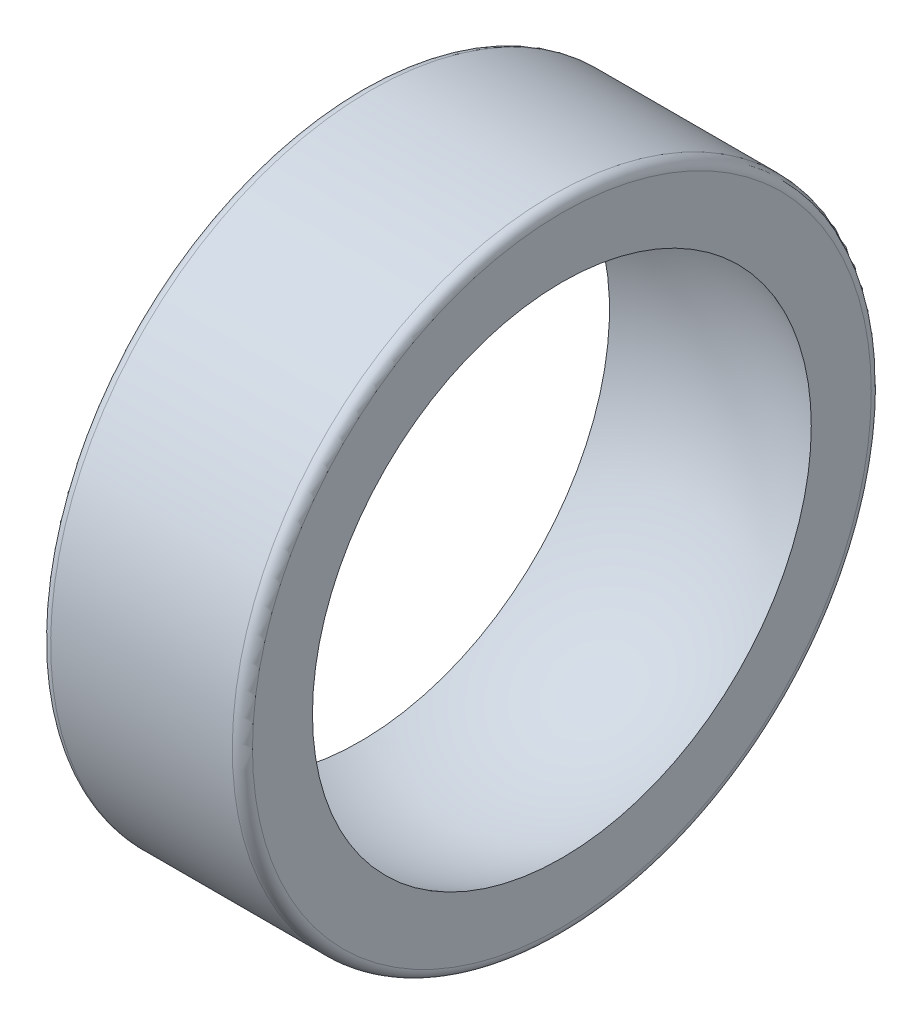
ISO-10303-21;
HEADER;
FILE_DESCRIPTION(('STEP AP214'),'2;1');
FILE_NAME('part.step','',(''),(''),'','','');
FILE_SCHEMA(('AUTOMOTIVE_DESIGN { 1 0 10303 214 1 1 1 1 }'));
ENDSEC;
DATA;
#1=APPLICATION_CONTEXT('core data for automotive mechanical design processes');
#2=APPLICATION_PROTOCOL_DEFINITION('international standard','automotive_design',2000,#1);
#3=PRODUCT_CONTEXT('',#1,'mechanical');
#4=PRODUCT('Part','Part','',(#3));
#5=PRODUCT_RELATED_PRODUCT_CATEGORY('part','',(#4));
#6=PRODUCT_DEFINITION_FORMATION('','',#4);
#7=PRODUCT_DEFINITION_CONTEXT('part definition',#1,'design');
#8=PRODUCT_DEFINITION('design','',#6,#7);
#9=PRODUCT_DEFINITION_SHAPE('','',#8);
#10=(LENGTH_UNIT() NAMED_UNIT(*) SI_UNIT(.MILLI.,.METRE.));
#11=(NAMED_UNIT(*) PLANE_ANGLE_UNIT() SI_UNIT($,.RADIAN.));
#12=(NAMED_UNIT(*) SI_UNIT($,.STERADIAN.) SOLID_ANGLE_UNIT());
#13=UNCERTAINTY_MEASURE_WITH_UNIT(LENGTH_MEASURE(1.E-05),#10,'distance_accuracy_value','');
#14=(GEOMETRIC_REPRESENTATION_CONTEXT(3) GLOBAL_UNCERTAINTY_ASSIGNED_CONTEXT((#13)) GLOBAL_UNIT_ASSIGNED_CONTEXT((#10,
#11,#12)) REPRESENTATION_CONTEXT('',''));
#15=CARTESIAN_POINT('',(0.,0.,0.));
#16=DIRECTION('',(0.,0.,1.));
#17=DIRECTION('',(1.,0.,0.));
#18=AXIS2_PLACEMENT_3D('',#15,#16,#17);
#19=CARTESIAN_POINT('',(-3.,4.6,0.));
#20=DIRECTION('',(-1.,0.,0.));
#21=DIRECTION('',(0.,-1.,0.));
#22=AXIS2_PLACEMENT_3D('',#19,#20,#21);
#23=PLANE('',#22);
#24=CARTESIAN_POINT('',(-3.,0.,0.));
#25=DIRECTION('',(1.,0.,0.));
#26=DIRECTION('',(0.,1.,0.));
#27=AXIS2_PLACEMENT_3D('',#24,#25,#26);
#28=CIRCLE('',#27,9.2);
#29=CARTESIAN_POINT('',(-3.,9.2,0.));
#30=VERTEX_POINT('',#29);
#31=EDGE_CURVE('E53',#30,#30,#28,.T.);
#32=ORIENTED_EDGE('',*,*,#31,.F.);
#33=EDGE_LOOP('',(#32));
#34=FACE_BOUND('',#33,.T.);
#35=CARTESIAN_POINT('',(-3.,0.,0.));
#36=DIRECTION('',(1.,0.,0.));
#37=DIRECTION('',(0.,0.,-1.));
#38=AXIS2_PLACEMENT_3D('',#35,#36,#37);
#39=CIRCLE('',#38,7.41619848709566);
#40=CARTESIAN_POINT('',(-3.,0.,7.41619848709566));
#41=VERTEX_POINT('',#40);
#42=EDGE_CURVE('E49',#41,#41,#39,.T.);
#43=ORIENTED_EDGE('',*,*,#42,.T.);
#44=EDGE_LOOP('',(#43));
#45=FACE_BOUND('',#44,.T.);
#46=ADVANCED_FACE('F16',(#34,#45),#23,.T.);
#47=CARTESIAN_POINT('',(3.,4.6,0.));
#48=DIRECTION('',(1.,0.,0.));
#49=DIRECTION('',(0.,1.,0.));
#50=AXIS2_PLACEMENT_3D('',#47,#48,#49);
#51=PLANE('',#50);
#52=CARTESIAN_POINT('',(3.,0.,0.));
#53=DIRECTION('',(1.,0.,0.));
#54=DIRECTION('',(0.,1.,0.));
#55=AXIS2_PLACEMENT_3D('',#52,#53,#54);
#56=CIRCLE('',#55,9.2);
#57=CARTESIAN_POINT('',(3.,9.2,0.));
#58=VERTEX_POINT('',#57);
#59=EDGE_CURVE('E11',#58,#58,#56,.T.);
#60=ORIENTED_EDGE('',*,*,#59,.T.);
#61=EDGE_LOOP('',(#60));
#62=FACE_BOUND('',#61,.T.);
#63=CARTESIAN_POINT('',(3.,0.,0.));
#64=DIRECTION('',(-1.,0.,0.));
#65=DIRECTION('',(0.,0.,1.));
#66=AXIS2_PLACEMENT_3D('',#63,#64,#65);
#67=CIRCLE('',#66,7.41619848709566);
#68=CARTESIAN_POINT('',(3.,0.,-7.41619848709566));
#69=VERTEX_POINT('',#68);
#70=EDGE_CURVE('E19',#69,#69,#67,.T.);
#71=ORIENTED_EDGE('',*,*,#70,.T.);
#72=EDGE_LOOP('',(#71));
#73=FACE_BOUND('',#72,.T.);
#74=ADVANCED_FACE('F71',(#62,#73),#51,.T.);
#75=CARTESIAN_POINT('',(2.7,0.,0.));
#76=DIRECTION('',(1.,0.,0.));
#77=DIRECTION('',(0.,0.,-1.));
#78=AXIS2_PLACEMENT_3D('',#75,#76,#77);
#79=TOROIDAL_SURFACE('',#78,9.2,0.3);
#80=CARTESIAN_POINT('',(2.7,0.,0.));
#81=DIRECTION('',(1.,0.,0.));
#82=DIRECTION('',(0.,1.,0.));
#83=AXIS2_PLACEMENT_3D('',#80,#81,#82);
#84=CIRCLE('',#83,9.5);
#85=CARTESIAN_POINT('',(2.7,9.5,0.));
#86=VERTEX_POINT('',#85);
#87=EDGE_CURVE('E25',#86,#86,#84,.T.);
#88=ORIENTED_EDGE('',*,*,#87,.T.);
#89=EDGE_LOOP('',(#88));
#90=FACE_BOUND('',#89,.T.);
#91=ORIENTED_EDGE('',*,*,#59,.F.);
#92=EDGE_LOOP('',(#91));
#93=FACE_BOUND('',#92,.T.);
#94=ADVANCED_FACE('F57',(#90,#93),#79,.T.);
#95=CARTESIAN_POINT('',(0.,0.,0.));
#96=DIRECTION('',(-1.,0.,0.));
#97=DIRECTION('',(0.,1.,0.));
#98=AXIS2_PLACEMENT_3D('',#95,#96,#97);
#99=CYLINDRICAL_SURFACE('',#98,9.5);
#100=CARTESIAN_POINT('',(-2.7,0.,0.));
#101=DIRECTION('',(1.,0.,0.));
#102=DIRECTION('',(0.,1.,0.));
#103=AXIS2_PLACEMENT_3D('',#100,#101,#102);
#104=CIRCLE('',#103,9.5);
#105=CARTESIAN_POINT('',(-2.7,9.5,0.));
#106=VERTEX_POINT('',#105);
#107=EDGE_CURVE('E39',#106,#106,#104,.T.);
#108=ORIENTED_EDGE('',*,*,#107,.T.);
#109=EDGE_LOOP('',(#108));
#110=FACE_BOUND('',#109,.T.);
#111=ORIENTED_EDGE('',*,*,#87,.F.);
#112=EDGE_LOOP('',(#111));
#113=FACE_BOUND('',#112,.T.);
#114=ADVANCED_FACE('F60',(#110,#113),#99,.T.);
#115=CARTESIAN_POINT('',(-2.7,0.,0.));
#116=DIRECTION('',(1.,0.,0.));
#117=DIRECTION('',(0.,0.,-1.));
#118=AXIS2_PLACEMENT_3D('',#115,#116,#117);
#119=TOROIDAL_SURFACE('',#118,9.2,0.3);
#120=ORIENTED_EDGE('',*,*,#31,.T.);
#121=EDGE_LOOP('',(#120));
#122=FACE_BOUND('',#121,.T.);
#123=ORIENTED_EDGE('',*,*,#107,.F.);
#124=EDGE_LOOP('',(#123));
#125=FACE_BOUND('',#124,.T.);
#126=ADVANCED_FACE('F62',(#122,#125),#119,.T.);
#127=CARTESIAN_POINT('',(0.,0.,0.));
#128=DIRECTION('',(0.,0.,1.));
#129=DIRECTION('',(1.,0.,0.));
#130=AXIS2_PLACEMENT_3D('',#127,#128,#129);
#131=SPHERICAL_SURFACE('',#130,8.);
#132=CARTESIAN_POINT('',(0.,0.,0.));
#133=DIRECTION('',(-1.,0.,0.));
#134=DIRECTION('',(0.,0.,1.));
#135=AXIS2_PLACEMENT_3D('',#132,#133,#134);
#136=SPHERICAL_SURFACE('',#135,8.);
#137=ORIENTED_EDGE('',*,*,#70,.F.);
#138=EDGE_LOOP('',(#137));
#139=FACE_BOUND('',#138,.T.);
#140=ORIENTED_EDGE('',*,*,#42,.F.);
#141=EDGE_LOOP('',(#140));
#142=FACE_BOUND('',#141,.T.);
#143=ADVANCED_FACE('F69',(#139,#142),#136,.F.);
#144=CLOSED_SHELL('',(#46,#74,#94,#114,#126,#143));
#145=MANIFOLD_SOLID_BREP('B1',#144);
#146=ADVANCED_BREP_SHAPE_REPRESENTATION('',(#18,#145),#14);
#147=SHAPE_DEFINITION_REPRESENTATION(#9,#146);
ENDSEC;
END-ISO-10303-21;
